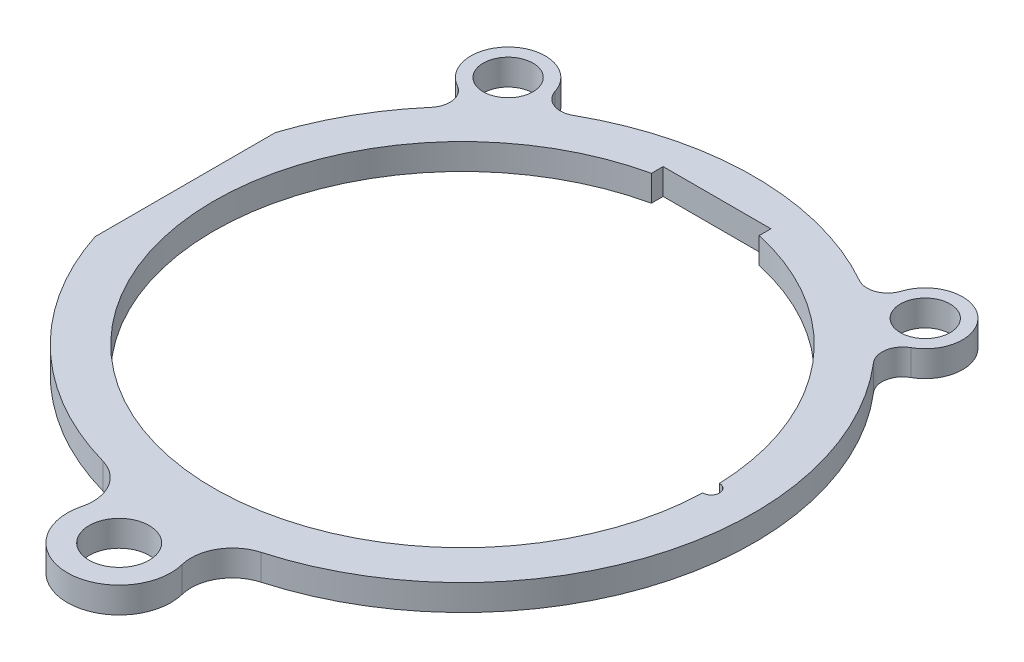
ISO-10303-21;
HEADER;
FILE_DESCRIPTION(('STEP AP214'),'2;1');
FILE_NAME('part.step','',(''),(''),'','','');
FILE_SCHEMA(('AUTOMOTIVE_DESIGN { 1 0 10303 214 1 1 1 1 }'));
ENDSEC;
DATA;
#1=APPLICATION_CONTEXT('core data for automotive mechanical design processes');
#2=APPLICATION_PROTOCOL_DEFINITION('international standard','automotive_design',2000,#1);
#3=PRODUCT_CONTEXT('',#1,'mechanical');
#4=PRODUCT('Part','Part','',(#3));
#5=PRODUCT_RELATED_PRODUCT_CATEGORY('part','',(#4));
#6=PRODUCT_DEFINITION_FORMATION('','',#4);
#7=PRODUCT_DEFINITION_CONTEXT('part definition',#1,'design');
#8=PRODUCT_DEFINITION('design','',#6,#7);
#9=PRODUCT_DEFINITION_SHAPE('','',#8);
#10=(LENGTH_UNIT() NAMED_UNIT(*) SI_UNIT(.MILLI.,.METRE.));
#11=(NAMED_UNIT(*) PLANE_ANGLE_UNIT() SI_UNIT($,.RADIAN.));
#12=(NAMED_UNIT(*) SI_UNIT($,.STERADIAN.) SOLID_ANGLE_UNIT());
#13=UNCERTAINTY_MEASURE_WITH_UNIT(LENGTH_MEASURE(1.E-05),#10,'distance_accuracy_value','');
#14=(GEOMETRIC_REPRESENTATION_CONTEXT(3) GLOBAL_UNCERTAINTY_ASSIGNED_CONTEXT((#13)) GLOBAL_UNIT_ASSIGNED_CONTEXT((#10,
#11,#12)) REPRESENTATION_CONTEXT('',''));
#15=CARTESIAN_POINT('',(0.,0.,0.));
#16=DIRECTION('',(0.,0.,1.));
#17=DIRECTION('',(1.,0.,0.));
#18=AXIS2_PLACEMENT_3D('',#15,#16,#17);
#19=CARTESIAN_POINT('',(0.,-0.79375,0.));
#20=DIRECTION('',(0.,1.,0.));
#21=DIRECTION('',(0.,0.,1.));
#22=AXIS2_PLACEMENT_3D('',#19,#20,#21);
#23=CYLINDRICAL_SURFACE('',#22,17.8599650524873);
#24=CARTESIAN_POINT('',(0.,-0.79375,0.));
#25=DIRECTION('',(0.,1.,0.));
#26=DIRECTION('',(0.,0.,1.));
#27=AXIS2_PLACEMENT_3D('',#24,#25,#26);
#28=CIRCLE('',#27,17.8599650524873);
#29=CARTESIAN_POINT('',(-16.9840587441892,-0.79375,5.5245));
#30=VERTEX_POINT('',#29);
#31=CARTESIAN_POINT('',(-4.85058295667171,-0.79375,17.1886647723584));
#32=VERTEX_POINT('',#31);
#33=EDGE_CURVE('E278',#30,#32,#28,.T.);
#34=ORIENTED_EDGE('',*,*,#33,.T.);
#35=DIRECTION('',(0.,1.,0.));
#36=VECTOR('',#35,1.);
#37=CARTESIAN_POINT('',(-4.85058295667171,-0.79375,17.1886647723584));
#38=LINE('',#37,#36);
#39=CARTESIAN_POINT('',(-4.85058295667171,0.79375,17.1886647723584));
#40=VERTEX_POINT('',#39);
#41=EDGE_CURVE('E216',#32,#40,#38,.T.);
#42=ORIENTED_EDGE('',*,*,#41,.T.);
#43=CARTESIAN_POINT('',(0.,0.79375,0.));
#44=DIRECTION('',(0.,1.,0.));
#45=DIRECTION('',(0.,0.,1.));
#46=AXIS2_PLACEMENT_3D('',#43,#44,#45);
#47=CIRCLE('',#46,17.8599650524873);
#48=CARTESIAN_POINT('',(-16.9840587441892,0.79375,5.5245));
#49=VERTEX_POINT('',#48);
#50=EDGE_CURVE('E271',#49,#40,#47,.T.);
#51=ORIENTED_EDGE('',*,*,#50,.F.);
#52=DIRECTION('',(0.,1.,0.));
#53=VECTOR('',#52,1.);
#54=CARTESIAN_POINT('',(-16.9840587441892,-0.79375,5.5245));
#55=LINE('',#54,#53);
#56=EDGE_CURVE('E302',#30,#49,#55,.T.);
#57=ORIENTED_EDGE('',*,*,#56,.F.);
#58=EDGE_LOOP('',(#34,#42,#51,#57));
#59=FACE_BOUND('',#58,.T.);
#60=ADVANCED_FACE('F35',(#59),#23,.T.);
#61=CARTESIAN_POINT('',(0.,-0.79375,0.));
#62=DIRECTION('',(0.,1.,0.));
#63=DIRECTION('',(0.,0.,1.));
#64=AXIS2_PLACEMENT_3D('',#61,#62,#63);
#65=CYLINDRICAL_SURFACE('',#64,17.8599650524873);
#66=DIRECTION('',(0.,1.,0.));
#67=VECTOR('',#66,1.);
#68=CARTESIAN_POINT('',(4.85058295667171,-0.79375,17.1886647723584));
#69=LINE('',#68,#67);
#70=CARTESIAN_POINT('',(4.85058295667171,-0.79375,17.1886647723584));
#71=VERTEX_POINT('',#70);
#72=CARTESIAN_POINT('',(4.85058295667171,0.79375,17.1886647723584));
#73=VERTEX_POINT('',#72);
#74=EDGE_CURVE('E195',#71,#73,#69,.T.);
#75=ORIENTED_EDGE('',*,*,#74,.F.);
#76=CARTESIAN_POINT('',(0.,-0.79375,0.));
#77=DIRECTION('',(0.,1.,0.));
#78=DIRECTION('',(0.,0.,1.));
#79=AXIS2_PLACEMENT_3D('',#76,#77,#78);
#80=CIRCLE('',#79,17.8599650524873);
#81=CARTESIAN_POINT('',(13.5461924936276,-0.79375,-11.639545549619));
#82=VERTEX_POINT('',#81);
#83=EDGE_CURVE('E182',#71,#82,#80,.T.);
#84=ORIENTED_EDGE('',*,*,#83,.T.);
#85=DIRECTION('',(0.,1.,0.));
#86=VECTOR('',#85,1.);
#87=CARTESIAN_POINT('',(13.5461924936276,-0.79375,-11.639545549619));
#88=LINE('',#87,#86);
#89=CARTESIAN_POINT('',(13.5461924936276,0.79375,-11.639545549619));
#90=VERTEX_POINT('',#89);
#91=EDGE_CURVE('E268',#82,#90,#88,.T.);
#92=ORIENTED_EDGE('',*,*,#91,.T.);
#93=CARTESIAN_POINT('',(0.,0.79375,0.));
#94=DIRECTION('',(0.,1.,0.));
#95=DIRECTION('',(0.,0.,1.));
#96=AXIS2_PLACEMENT_3D('',#93,#94,#95);
#97=CIRCLE('',#96,17.8599650524873);
#98=EDGE_CURVE('E282',#73,#90,#97,.T.);
#99=ORIENTED_EDGE('',*,*,#98,.F.);
#100=EDGE_LOOP('',(#75,#84,#92,#99));
#101=FACE_BOUND('',#100,.T.);
#102=ADVANCED_FACE('F378',(#101),#65,.T.);
#103=CARTESIAN_POINT('',(0.,0.79375,0.));
#104=DIRECTION('',(0.,1.,0.));
#105=DIRECTION('',(0.,0.,1.));
#106=AXIS2_PLACEMENT_3D('',#103,#104,#105);
#107=PLANE('',#106);
#108=CARTESIAN_POINT('',(5.54042085242001,0.79375,19.6331941089771));
#109=DIRECTION('',(0.,1.,0.));
#110=DIRECTION('',(0.,0.,1.));
#111=AXIS2_PLACEMENT_3D('',#108,#109,#110);
#112=CIRCLE('',#111,2.54);
#113=CARTESIAN_POINT('',(3.07801158467778,0.79375,20.2562034172039));
#114=VERTEX_POINT('',#113);
#115=EDGE_CURVE('E191',#73,#114,#112,.T.);
#116=ORIENTED_EDGE('',*,*,#115,.F.);
#117=ORIENTED_EDGE('',*,*,#98,.T.);
#118=CARTESIAN_POINT('',(14.509445468443,0.79375,-12.4672192211281));
#119=DIRECTION('',(0.,1.,0.));
#120=DIRECTION('',(0.,0.,1.));
#121=AXIS2_PLACEMENT_3D('',#118,#119,#120);
#122=CIRCLE('',#121,1.27);
#123=CARTESIAN_POINT('',(13.8915505130217,0.79375,-13.5767713037564));
#124=VERTEX_POINT('',#123);
#125=EDGE_CURVE('E240',#124,#90,#122,.T.);
#126=ORIENTED_EDGE('',*,*,#125,.F.);
#127=CARTESIAN_POINT('',(12.7793395932632,0.79375,-15.5739650524873));
#128=DIRECTION('',(0.,1.,0.));
#129=DIRECTION('',(0.,0.,1.));
#130=AXIS2_PLACEMENT_3D('',#127,#128,#129);
#131=CIRCLE('',#130,2.28599999999999);
#132=CARTESIAN_POINT('',(10.6034384604149,0.79375,-16.2748575264587));
#133=VERTEX_POINT('',#132);
#134=EDGE_CURVE('E260',#124,#133,#131,.T.);
#135=ORIENTED_EDGE('',*,*,#134,.T.);
#136=CARTESIAN_POINT('',(9.39460449772144,0.79375,-16.6642422342205));
#137=DIRECTION('',(0.,1.,0.));
#138=DIRECTION('',(0.,0.,1.));
#139=AXIS2_PLACEMENT_3D('',#136,#137,#138);
#140=CIRCLE('',#139,1.27);
#141=CARTESIAN_POINT('',(8.77091555321106,0.79375,-15.5579366252247));
#142=VERTEX_POINT('',#141);
#143=EDGE_CURVE('E263',#142,#133,#140,.T.);
#144=ORIENTED_EDGE('',*,*,#143,.F.);
#145=CARTESIAN_POINT('',(0.,0.79375,0.));
#146=DIRECTION('',(0.,1.,0.));
#147=DIRECTION('',(0.,0.,1.));
#148=AXIS2_PLACEMENT_3D('',#145,#146,#147);
#149=CIRCLE('',#148,17.8599650524873);
#150=CARTESIAN_POINT('',(-8.77091555321106,0.79375,-15.5579366252247));
#151=VERTEX_POINT('',#150);
#152=EDGE_CURVE('E58',#142,#151,#149,.T.);
#153=ORIENTED_EDGE('',*,*,#152,.T.);
#154=CARTESIAN_POINT('',(-9.39460449772144,0.79375,-16.6642422342205));
#155=DIRECTION('',(0.,1.,0.));
#156=DIRECTION('',(0.,0.,1.));
#157=AXIS2_PLACEMENT_3D('',#154,#155,#156);
#158=CIRCLE('',#157,1.27);
#159=CARTESIAN_POINT('',(-10.6034384604149,0.79375,-16.2748575264587));
#160=VERTEX_POINT('',#159);
#161=EDGE_CURVE('E215',#160,#151,#158,.T.);
#162=ORIENTED_EDGE('',*,*,#161,.F.);
#163=CARTESIAN_POINT('',(-12.7793395932632,0.79375,-15.5739650524873));
#164=DIRECTION('',(0.,1.,0.));
#165=DIRECTION('',(0.,0.,1.));
#166=AXIS2_PLACEMENT_3D('',#163,#164,#165);
#167=CIRCLE('',#166,2.28599999999999);
#168=CARTESIAN_POINT('',(-13.8915505130217,0.79375,-13.5767713037564));
#169=VERTEX_POINT('',#168);
#170=EDGE_CURVE('E233',#160,#169,#167,.T.);
#171=ORIENTED_EDGE('',*,*,#170,.T.);
#172=CARTESIAN_POINT('',(-14.509445468443,0.79375,-12.4672192211281));
#173=DIRECTION('',(0.,1.,0.));
#174=DIRECTION('',(0.,0.,1.));
#175=AXIS2_PLACEMENT_3D('',#172,#173,#174);
#176=CIRCLE('',#175,1.27);
#177=CARTESIAN_POINT('',(-13.5461924936276,0.79375,-11.639545549619));
#178=VERTEX_POINT('',#177);
#179=EDGE_CURVE('E50',#178,#169,#176,.T.);
#180=ORIENTED_EDGE('',*,*,#179,.F.);
#181=CARTESIAN_POINT('',(-16.9840587441892,0.79375,-5.5245));
#182=VERTEX_POINT('',#181);
#183=EDGE_CURVE('E290',#178,#182,#149,.T.);
#184=ORIENTED_EDGE('',*,*,#183,.T.);
#185=DIRECTION('',(0.,0.,-1.));
#186=VECTOR('',#185,1.);
#187=CARTESIAN_POINT('',(-16.9840587441892,0.79375,-5.5245));
#188=LINE('',#187,#186);
#189=EDGE_CURVE('E298',#49,#182,#188,.T.);
#190=ORIENTED_EDGE('',*,*,#189,.F.);
#191=ORIENTED_EDGE('',*,*,#50,.T.);
#192=CARTESIAN_POINT('',(-5.54042085242001,0.79375,19.6331941089771));
#193=DIRECTION('',(0.,1.,0.));
#194=DIRECTION('',(0.,0.,1.));
#195=AXIS2_PLACEMENT_3D('',#192,#193,#194);
#196=CIRCLE('',#195,2.54);
#197=CARTESIAN_POINT('',(-3.07801158467778,0.79375,20.2562034172039));
#198=VERTEX_POINT('',#197);
#199=EDGE_CURVE('E203',#198,#40,#196,.T.);
#200=ORIENTED_EDGE('',*,*,#199,.F.);
#201=CARTESIAN_POINT('',(0.,0.79375,21.0349650524873));
#202=DIRECTION('',(0.,1.,0.));
#203=DIRECTION('',(0.,0.,1.));
#204=AXIS2_PLACEMENT_3D('',#201,#202,#203);
#205=CIRCLE('',#204,3.175);
#206=EDGE_CURVE('E210',#198,#114,#205,.T.);
#207=ORIENTED_EDGE('',*,*,#206,.T.);
#208=EDGE_LOOP('',(#116,#117,#126,#135,#144,#153,#162,#171,#180,#184,#190,#191,#200,#207));
#209=FACE_BOUND('',#208,.T.);
#210=CARTESIAN_POINT('',(15.24,0.79375,0.));
#211=DIRECTION('',(0.,1.,0.));
#212=DIRECTION('',(0.,0.,1.));
#213=AXIS2_PLACEMENT_3D('',#210,#211,#212);
#214=CIRCLE('',#213,0.508000000000006);
#215=CARTESIAN_POINT('',(15.2315333333333,0.79375,0.507929439544078));
#216=VERTEX_POINT('',#215);
#217=CARTESIAN_POINT('',(15.2315333333333,0.79375,-0.507929439544078));
#218=VERTEX_POINT('',#217);
#219=EDGE_CURVE('E287',#216,#218,#214,.T.);
#220=ORIENTED_EDGE('',*,*,#219,.F.);
#221=CARTESIAN_POINT('',(0.,0.79375,0.));
#222=DIRECTION('',(0.,1.,0.));
#223=DIRECTION('',(0.,0.,1.));
#224=AXIS2_PLACEMENT_3D('',#221,#222,#223);
#225=CIRCLE('',#224,15.24);
#226=CARTESIAN_POINT('',(-3.302,0.79375,-14.8779835999372));
#227=VERTEX_POINT('',#226);
#228=EDGE_CURVE('E311',#227,#216,#225,.T.);
#229=ORIENTED_EDGE('',*,*,#228,.F.);
#230=DIRECTION('',(0.,0.,1.));
#231=VECTOR('',#230,1.);
#232=CARTESIAN_POINT('',(-3.30199999999999,0.79375,0.));
#233=LINE('',#232,#231);
#234=CARTESIAN_POINT('',(-3.302,0.79375,-15.5956));
#235=VERTEX_POINT('',#234);
#236=EDGE_CURVE('E314',#235,#227,#233,.T.);
#237=ORIENTED_EDGE('',*,*,#236,.F.);
#238=DIRECTION('',(1.,0.,0.));
#239=VECTOR('',#238,1.);
#240=CARTESIAN_POINT('',(0.,0.79375,-15.5956));
#241=LINE('',#240,#239);
#242=CARTESIAN_POINT('',(3.302,0.79375,-15.5956));
#243=VERTEX_POINT('',#242);
#244=EDGE_CURVE('E318',#235,#243,#241,.T.);
#245=ORIENTED_EDGE('',*,*,#244,.T.);
#246=DIRECTION('',(0.,0.,1.));
#247=VECTOR('',#246,1.);
#248=CARTESIAN_POINT('',(3.302,0.79375,0.));
#249=LINE('',#248,#247);
#250=CARTESIAN_POINT('',(3.302,0.79375,-14.8779835999372));
#251=VERTEX_POINT('',#250);
#252=EDGE_CURVE('E320',#243,#251,#249,.T.);
#253=ORIENTED_EDGE('',*,*,#252,.T.);
#254=EDGE_CURVE('E315',#218,#251,#225,.T.);
#255=ORIENTED_EDGE('',*,*,#254,.F.);
#256=EDGE_LOOP('',(#220,#229,#237,#245,#253,#255));
#257=FACE_BOUND('',#256,.T.);
#258=CARTESIAN_POINT('',(12.7793395932632,0.79375,-15.5739650524873));
#259=DIRECTION('',(0.,1.,0.));
#260=DIRECTION('',(0.,0.,1.));
#261=AXIS2_PLACEMENT_3D('',#258,#259,#260);
#262=CIRCLE('',#261,1.524);
#263=CARTESIAN_POINT('',(12.7793395932632,0.79375,-14.0499650524873));
#264=VERTEX_POINT('',#263);
#265=EDGE_CURVE('E249',#264,#264,#262,.T.);
#266=ORIENTED_EDGE('',*,*,#265,.F.);
#267=EDGE_LOOP('',(#266));
#268=FACE_BOUND('',#267,.T.);
#269=CARTESIAN_POINT('',(-12.7793395932632,0.79375,-15.5739650524873));
#270=DIRECTION('',(0.,1.,0.));
#271=DIRECTION('',(0.,0.,1.));
#272=AXIS2_PLACEMENT_3D('',#269,#270,#271);
#273=CIRCLE('',#272,1.524);
#274=CARTESIAN_POINT('',(-12.7793395932632,0.79375,-14.0499650524873));
#275=VERTEX_POINT('',#274);
#276=EDGE_CURVE('E223',#275,#275,#273,.T.);
#277=ORIENTED_EDGE('',*,*,#276,.F.);
#278=EDGE_LOOP('',(#277));
#279=FACE_BOUND('',#278,.T.);
#280=CARTESIAN_POINT('',(0.,0.79375,21.0349650524873));
#281=DIRECTION('',(0.,1.,0.));
#282=DIRECTION('',(0.,0.,1.));
#283=AXIS2_PLACEMENT_3D('',#280,#281,#282);
#284=CIRCLE('',#283,1.8415);
#285=CARTESIAN_POINT('',(0.,0.79375,22.8764650524873));
#286=VERTEX_POINT('',#285);
#287=EDGE_CURVE('E207',#286,#286,#284,.T.);
#288=ORIENTED_EDGE('',*,*,#287,.F.);
#289=EDGE_LOOP('',(#288));
#290=FACE_BOUND('',#289,.T.);
#291=ADVANCED_FACE('F364',(#209,#257,#268,#279,#290),#107,.T.);
#292=CARTESIAN_POINT('',(0.,-0.79375,0.));
#293=DIRECTION('',(0.,1.,0.));
#294=DIRECTION('',(0.,0.,1.));
#295=AXIS2_PLACEMENT_3D('',#292,#293,#294);
#296=PLANE('',#295);
#297=ORIENTED_EDGE('',*,*,#83,.F.);
#298=CARTESIAN_POINT('',(5.54042085242001,-0.79375,19.6331941089771));
#299=DIRECTION('',(0.,1.,0.));
#300=DIRECTION('',(0.,0.,1.));
#301=AXIS2_PLACEMENT_3D('',#298,#299,#300);
#302=CIRCLE('',#301,2.54);
#303=CARTESIAN_POINT('',(3.07801158467778,-0.79375,20.2562034172039));
#304=VERTEX_POINT('',#303);
#305=EDGE_CURVE('E175',#71,#304,#302,.T.);
#306=ORIENTED_EDGE('',*,*,#305,.T.);
#307=CARTESIAN_POINT('',(0.,-0.79375,21.0349650524873));
#308=DIRECTION('',(0.,1.,0.));
#309=DIRECTION('',(0.,0.,1.));
#310=AXIS2_PLACEMENT_3D('',#307,#308,#309);
#311=CIRCLE('',#310,3.175);
#312=CARTESIAN_POINT('',(-3.07801158467778,-0.79375,20.2562034172039));
#313=VERTEX_POINT('',#312);
#314=EDGE_CURVE('E180',#313,#304,#311,.T.);
#315=ORIENTED_EDGE('',*,*,#314,.F.);
#316=CARTESIAN_POINT('',(-5.54042085242001,-0.79375,19.6331941089771));
#317=DIRECTION('',(0.,1.,0.));
#318=DIRECTION('',(0.,0.,1.));
#319=AXIS2_PLACEMENT_3D('',#316,#317,#318);
#320=CIRCLE('',#319,2.54);
#321=EDGE_CURVE('E186',#313,#32,#320,.T.);
#322=ORIENTED_EDGE('',*,*,#321,.T.);
#323=ORIENTED_EDGE('',*,*,#33,.F.);
#324=DIRECTION('',(0.,0.,-1.));
#325=VECTOR('',#324,1.);
#326=CARTESIAN_POINT('',(-16.9840587441892,-0.79375,-5.5245));
#327=LINE('',#326,#325);
#328=CARTESIAN_POINT('',(-16.9840587441892,-0.79375,-5.5245));
#329=VERTEX_POINT('',#328);
#330=EDGE_CURVE('E299',#30,#329,#327,.T.);
#331=ORIENTED_EDGE('',*,*,#330,.T.);
#332=CARTESIAN_POINT('',(0.,-0.79375,0.));
#333=DIRECTION('',(0.,1.,0.));
#334=DIRECTION('',(0.,0.,1.));
#335=AXIS2_PLACEMENT_3D('',#332,#333,#334);
#336=CIRCLE('',#335,17.8599650524873);
#337=CARTESIAN_POINT('',(-13.5461924936276,-0.79375,-11.639545549619));
#338=VERTEX_POINT('',#337);
#339=EDGE_CURVE('E281',#338,#329,#336,.T.);
#340=ORIENTED_EDGE('',*,*,#339,.F.);
#341=CARTESIAN_POINT('',(-14.509445468443,-0.79375,-12.4672192211281));
#342=DIRECTION('',(0.,1.,0.));
#343=DIRECTION('',(0.,0.,1.));
#344=AXIS2_PLACEMENT_3D('',#341,#342,#343);
#345=CIRCLE('',#344,1.27);
#346=CARTESIAN_POINT('',(-13.8915505130217,-0.79375,-13.5767713037564));
#347=VERTEX_POINT('',#346);
#348=EDGE_CURVE('E226',#338,#347,#345,.T.);
#349=ORIENTED_EDGE('',*,*,#348,.T.);
#350=CARTESIAN_POINT('',(-12.7793395932632,-0.79375,-15.5739650524873));
#351=DIRECTION('',(0.,1.,0.));
#352=DIRECTION('',(0.,0.,1.));
#353=AXIS2_PLACEMENT_3D('',#350,#351,#352);
#354=CIRCLE('',#353,2.28599999999999);
#355=CARTESIAN_POINT('',(-10.6034384604149,-0.79375,-16.2748575264587));
#356=VERTEX_POINT('',#355);
#357=EDGE_CURVE('E222',#356,#347,#354,.T.);
#358=ORIENTED_EDGE('',*,*,#357,.F.);
#359=CARTESIAN_POINT('',(-9.39460449772144,-0.79375,-16.6642422342205));
#360=DIRECTION('',(0.,1.,0.));
#361=DIRECTION('',(0.,0.,1.));
#362=AXIS2_PLACEMENT_3D('',#359,#360,#361);
#363=CIRCLE('',#362,1.27);
#364=CARTESIAN_POINT('',(-8.77091555321106,-0.79375,-15.5579366252247));
#365=VERTEX_POINT('',#364);
#366=EDGE_CURVE('E220',#356,#365,#363,.T.);
#367=ORIENTED_EDGE('',*,*,#366,.T.);
#368=CARTESIAN_POINT('',(8.77091555321106,-0.79375,-15.5579366252247));
#369=VERTEX_POINT('',#368);
#370=EDGE_CURVE('E283',#369,#365,#336,.T.);
#371=ORIENTED_EDGE('',*,*,#370,.F.);
#372=CARTESIAN_POINT('',(9.39460449772144,-0.79375,-16.6642422342205));
#373=DIRECTION('',(0.,1.,0.));
#374=DIRECTION('',(0.,0.,1.));
#375=AXIS2_PLACEMENT_3D('',#372,#373,#374);
#376=CIRCLE('',#375,1.27);
#377=CARTESIAN_POINT('',(10.6034384604149,-0.79375,-16.2748575264587));
#378=VERTEX_POINT('',#377);
#379=EDGE_CURVE('E252',#369,#378,#376,.T.);
#380=ORIENTED_EDGE('',*,*,#379,.T.);
#381=CARTESIAN_POINT('',(12.7793395932632,-0.79375,-15.5739650524873));
#382=DIRECTION('',(0.,1.,0.));
#383=DIRECTION('',(0.,0.,1.));
#384=AXIS2_PLACEMENT_3D('',#381,#382,#383);
#385=CIRCLE('',#384,2.28599999999999);
#386=CARTESIAN_POINT('',(13.8915505130217,-0.79375,-13.5767713037564));
#387=VERTEX_POINT('',#386);
#388=EDGE_CURVE('E248',#387,#378,#385,.T.);
#389=ORIENTED_EDGE('',*,*,#388,.F.);
#390=CARTESIAN_POINT('',(14.509445468443,-0.79375,-12.4672192211281));
#391=DIRECTION('',(0.,1.,0.));
#392=DIRECTION('',(0.,0.,1.));
#393=AXIS2_PLACEMENT_3D('',#390,#391,#392);
#394=CIRCLE('',#393,1.27);
#395=EDGE_CURVE('E246',#387,#82,#394,.T.);
#396=ORIENTED_EDGE('',*,*,#395,.T.);
#397=EDGE_LOOP('',(#297,#306,#315,#322,#323,#331,#340,#349,#358,#367,#371,#380,#389,#396));
#398=FACE_BOUND('',#397,.T.);
#399=CARTESIAN_POINT('',(0.,-0.79375,0.));
#400=DIRECTION('',(0.,1.,0.));
#401=DIRECTION('',(0.,0.,1.));
#402=AXIS2_PLACEMENT_3D('',#399,#400,#401);
#403=CIRCLE('',#402,15.24);
#404=CARTESIAN_POINT('',(-3.302,-0.79375,-14.8779835999372));
#405=VERTEX_POINT('',#404);
#406=CARTESIAN_POINT('',(15.2315333333333,-0.79375,0.507929439544078));
#407=VERTEX_POINT('',#406);
#408=EDGE_CURVE('E324',#405,#407,#403,.T.);
#409=ORIENTED_EDGE('',*,*,#408,.T.);
#410=CARTESIAN_POINT('',(15.24,-0.79375,0.));
#411=DIRECTION('',(0.,1.,0.));
#412=DIRECTION('',(0.,0.,1.));
#413=AXIS2_PLACEMENT_3D('',#410,#411,#412);
#414=CIRCLE('',#413,0.508000000000006);
#415=CARTESIAN_POINT('',(15.2315333333333,-0.79375,-0.50792943954407));
#416=VERTEX_POINT('',#415);
#417=EDGE_CURVE('E11',#407,#416,#414,.T.);
#418=ORIENTED_EDGE('',*,*,#417,.T.);
#419=CARTESIAN_POINT('',(3.302,-0.79375,-14.8779835999372));
#420=VERTEX_POINT('',#419);
#421=EDGE_CURVE('E308',#416,#420,#403,.T.);
#422=ORIENTED_EDGE('',*,*,#421,.T.);
#423=DIRECTION('',(0.,0.,1.));
#424=VECTOR('',#423,1.);
#425=CARTESIAN_POINT('',(3.302,-0.79375,0.));
#426=LINE('',#425,#424);
#427=CARTESIAN_POINT('',(3.302,-0.79375,-15.5956));
#428=VERTEX_POINT('',#427);
#429=EDGE_CURVE('E332',#428,#420,#426,.T.);
#430=ORIENTED_EDGE('',*,*,#429,.F.);
#431=DIRECTION('',(1.,0.,0.));
#432=VECTOR('',#431,1.);
#433=CARTESIAN_POINT('',(0.,-0.79375,-15.5956));
#434=LINE('',#433,#432);
#435=CARTESIAN_POINT('',(-3.302,-0.79375,-15.5956));
#436=VERTEX_POINT('',#435);
#437=EDGE_CURVE('E330',#436,#428,#434,.T.);
#438=ORIENTED_EDGE('',*,*,#437,.F.);
#439=DIRECTION('',(0.,0.,1.));
#440=VECTOR('',#439,1.);
#441=CARTESIAN_POINT('',(-3.30199999999999,-0.79375,0.));
#442=LINE('',#441,#440);
#443=EDGE_CURVE('E327',#436,#405,#442,.T.);
#444=ORIENTED_EDGE('',*,*,#443,.T.);
#445=EDGE_LOOP('',(#409,#418,#422,#430,#438,#444));
#446=FACE_BOUND('',#445,.T.);
#447=CARTESIAN_POINT('',(12.7793395932632,-0.79375,-15.5739650524873));
#448=DIRECTION('',(0.,1.,0.));
#449=DIRECTION('',(0.,0.,1.));
#450=AXIS2_PLACEMENT_3D('',#447,#448,#449);
#451=CIRCLE('',#450,1.524);
#452=CARTESIAN_POINT('',(12.7793395932632,-0.79375,-14.0499650524873));
#453=VERTEX_POINT('',#452);
#454=EDGE_CURVE('E254',#453,#453,#451,.T.);
#455=ORIENTED_EDGE('',*,*,#454,.T.);
#456=EDGE_LOOP('',(#455));
#457=FACE_BOUND('',#456,.T.);
#458=CARTESIAN_POINT('',(-12.7793395932632,-0.79375,-15.5739650524873));
#459=DIRECTION('',(0.,1.,0.));
#460=DIRECTION('',(0.,0.,1.));
#461=AXIS2_PLACEMENT_3D('',#458,#459,#460);
#462=CIRCLE('',#461,1.524);
#463=CARTESIAN_POINT('',(-12.7793395932632,-0.79375,-14.0499650524873));
#464=VERTEX_POINT('',#463);
#465=EDGE_CURVE('E228',#464,#464,#462,.T.);
#466=ORIENTED_EDGE('',*,*,#465,.T.);
#467=EDGE_LOOP('',(#466));
#468=FACE_BOUND('',#467,.T.);
#469=CARTESIAN_POINT('',(0.,-0.79375,21.0349650524873));
#470=DIRECTION('',(0.,1.,0.));
#471=DIRECTION('',(0.,0.,1.));
#472=AXIS2_PLACEMENT_3D('',#469,#470,#471);
#473=CIRCLE('',#472,1.8415);
#474=CARTESIAN_POINT('',(0.,-0.79375,22.8764650524873));
#475=VERTEX_POINT('',#474);
#476=EDGE_CURVE('E200',#475,#475,#473,.T.);
#477=ORIENTED_EDGE('',*,*,#476,.T.);
#478=EDGE_LOOP('',(#477));
#479=FACE_BOUND('',#478,.T.);
#480=ADVANCED_FACE('F177',(#398,#446,#457,#468,#479),#296,.F.);
#481=CARTESIAN_POINT('',(0.,0.79375,0.));
#482=DIRECTION('',(0.,-1.,0.));
#483=DIRECTION('',(0.,0.,-1.));
#484=AXIS2_PLACEMENT_3D('',#481,#482,#483);
#485=CYLINDRICAL_SURFACE('',#484,15.24);
#486=DIRECTION('',(0.,1.,0.));
#487=VECTOR('',#486,1.);
#488=CARTESIAN_POINT('',(15.2315333333333,0.,0.507929439544078));
#489=LINE('',#488,#487);
#490=EDGE_CURVE('E296',#407,#216,#489,.T.);
#491=ORIENTED_EDGE('',*,*,#490,.F.);
#492=ORIENTED_EDGE('',*,*,#408,.F.);
#493=DIRECTION('',(0.,-1.,0.));
#494=VECTOR('',#493,1.);
#495=CARTESIAN_POINT('',(-3.302,0.79375,-14.8779835999372));
#496=LINE('',#495,#494);
#497=EDGE_CURVE('E43',#227,#405,#496,.T.);
#498=ORIENTED_EDGE('',*,*,#497,.F.);
#499=ORIENTED_EDGE('',*,*,#228,.T.);
#500=EDGE_LOOP('',(#491,#492,#498,#499));
#501=FACE_BOUND('',#500,.T.);
#502=ADVANCED_FACE('F349',(#501),#485,.F.);
#503=DIRECTION('',(0.,1.,0.));
#504=VECTOR('',#503,1.);
#505=CARTESIAN_POINT('',(15.2315333333333,0.,-0.507929439544078));
#506=LINE('',#505,#504);
#507=EDGE_CURVE('E294',#218,#416,#506,.F.);
#508=ORIENTED_EDGE('',*,*,#507,.F.);
#509=ORIENTED_EDGE('',*,*,#254,.T.);
#510=DIRECTION('',(0.,-1.,0.));
#511=VECTOR('',#510,1.);
#512=CARTESIAN_POINT('',(3.302,0.79375,-14.8779835999372));
#513=LINE('',#512,#511);
#514=EDGE_CURVE('E323',#251,#420,#513,.T.);
#515=ORIENTED_EDGE('',*,*,#514,.T.);
#516=ORIENTED_EDGE('',*,*,#421,.F.);
#517=EDGE_LOOP('',(#508,#509,#515,#516));
#518=FACE_BOUND('',#517,.T.);
#519=ADVANCED_FACE('F37',(#518),#485,.F.);
#520=CARTESIAN_POINT('',(-3.30199999999999,0.79375,0.));
#521=DIRECTION('',(1.,0.,0.));
#522=DIRECTION('',(0.,0.,-1.));
#523=AXIS2_PLACEMENT_3D('',#520,#521,#522);
#524=PLANE('',#523);
#525=ORIENTED_EDGE('',*,*,#443,.F.);
#526=DIRECTION('',(0.,-1.,0.));
#527=VECTOR('',#526,1.);
#528=CARTESIAN_POINT('',(-3.302,0.79375,-15.5956));
#529=LINE('',#528,#527);
#530=EDGE_CURVE('E340',#235,#436,#529,.T.);
#531=ORIENTED_EDGE('',*,*,#530,.F.);
#532=ORIENTED_EDGE('',*,*,#236,.T.);
#533=ORIENTED_EDGE('',*,*,#497,.T.);
#534=EDGE_LOOP('',(#525,#531,#532,#533));
#535=FACE_BOUND('',#534,.T.);
#536=ADVANCED_FACE('F344',(#535),#524,.T.);
#537=CARTESIAN_POINT('',(0.,0.79375,-15.5956));
#538=DIRECTION('',(0.,0.,-1.));
#539=DIRECTION('',(-1.,0.,0.));
#540=AXIS2_PLACEMENT_3D('',#537,#538,#539);
#541=PLANE('',#540);
#542=ORIENTED_EDGE('',*,*,#437,.T.);
#543=DIRECTION('',(0.,-1.,0.));
#544=VECTOR('',#543,1.);
#545=CARTESIAN_POINT('',(3.302,0.79375,-15.5956));
#546=LINE('',#545,#544);
#547=EDGE_CURVE('E337',#243,#428,#546,.T.);
#548=ORIENTED_EDGE('',*,*,#547,.F.);
#549=ORIENTED_EDGE('',*,*,#244,.F.);
#550=ORIENTED_EDGE('',*,*,#530,.T.);
#551=EDGE_LOOP('',(#542,#548,#549,#550));
#552=FACE_BOUND('',#551,.T.);
#553=ADVANCED_FACE('F355',(#552),#541,.F.);
#554=CARTESIAN_POINT('',(3.302,0.79375,0.));
#555=DIRECTION('',(1.,0.,0.));
#556=DIRECTION('',(0.,0.,-1.));
#557=AXIS2_PLACEMENT_3D('',#554,#555,#556);
#558=PLANE('',#557);
#559=ORIENTED_EDGE('',*,*,#429,.T.);
#560=ORIENTED_EDGE('',*,*,#514,.F.);
#561=ORIENTED_EDGE('',*,*,#252,.F.);
#562=ORIENTED_EDGE('',*,*,#547,.T.);
#563=EDGE_LOOP('',(#559,#560,#561,#562));
#564=FACE_BOUND('',#563,.T.);
#565=ADVANCED_FACE('F359',(#564),#558,.F.);
#566=CARTESIAN_POINT('',(-16.9840587441892,-0.79375,-5.5245));
#567=DIRECTION('',(1.,0.,0.));
#568=DIRECTION('',(0.,0.,-1.));
#569=AXIS2_PLACEMENT_3D('',#566,#567,#568);
#570=PLANE('',#569);
#571=ORIENTED_EDGE('',*,*,#189,.T.);
#572=DIRECTION('',(0.,1.,0.));
#573=VECTOR('',#572,1.);
#574=CARTESIAN_POINT('',(-16.9840587441892,-0.79375,-5.5245));
#575=LINE('',#574,#573);
#576=EDGE_CURVE('E305',#329,#182,#575,.T.);
#577=ORIENTED_EDGE('',*,*,#576,.F.);
#578=ORIENTED_EDGE('',*,*,#330,.F.);
#579=ORIENTED_EDGE('',*,*,#56,.T.);
#580=EDGE_LOOP('',(#571,#577,#578,#579));
#581=FACE_BOUND('',#580,.T.);
#582=ADVANCED_FACE('F393',(#581),#570,.F.);
#583=CARTESIAN_POINT('',(15.24,-0.79375,0.));
#584=DIRECTION('',(0.,1.,0.));
#585=DIRECTION('',(0.,0.,1.));
#586=AXIS2_PLACEMENT_3D('',#583,#584,#585);
#587=CYLINDRICAL_SURFACE('',#586,0.508000000000006);
#588=ORIENTED_EDGE('',*,*,#490,.T.);
#589=ORIENTED_EDGE('',*,*,#219,.T.);
#590=ORIENTED_EDGE('',*,*,#507,.T.);
#591=ORIENTED_EDGE('',*,*,#417,.F.);
#592=EDGE_LOOP('',(#588,#589,#590,#591));
#593=FACE_BOUND('',#592,.T.);
#594=ADVANCED_FACE('F368',(#593),#587,.F.);
#595=DIRECTION('',(0.,1.,0.));
#596=VECTOR('',#595,1.);
#597=CARTESIAN_POINT('',(-13.5461924936276,-0.79375,-11.639545549619));
#598=LINE('',#597,#596);
#599=EDGE_CURVE('E241',#338,#178,#598,.T.);
#600=ORIENTED_EDGE('',*,*,#599,.F.);
#601=ORIENTED_EDGE('',*,*,#339,.T.);
#602=ORIENTED_EDGE('',*,*,#576,.T.);
#603=ORIENTED_EDGE('',*,*,#183,.F.);
#604=EDGE_LOOP('',(#600,#601,#602,#603));
#605=FACE_BOUND('',#604,.T.);
#606=ADVANCED_FACE('F387',(#605),#65,.T.);
#607=DIRECTION('',(0.,1.,0.));
#608=VECTOR('',#607,1.);
#609=CARTESIAN_POINT('',(8.77091555321106,-0.79375,-15.5579366252247));
#610=LINE('',#609,#608);
#611=EDGE_CURVE('E272',#369,#142,#610,.T.);
#612=ORIENTED_EDGE('',*,*,#611,.F.);
#613=ORIENTED_EDGE('',*,*,#370,.T.);
#614=DIRECTION('',(0.,1.,0.));
#615=VECTOR('',#614,1.);
#616=CARTESIAN_POINT('',(-8.77091555321106,-0.79375,-15.5579366252247));
#617=LINE('',#616,#615);
#618=EDGE_CURVE('E238',#365,#151,#617,.T.);
#619=ORIENTED_EDGE('',*,*,#618,.T.);
#620=ORIENTED_EDGE('',*,*,#152,.F.);
#621=EDGE_LOOP('',(#612,#613,#619,#620));
#622=FACE_BOUND('',#621,.T.);
#623=ADVANCED_FACE('F388',(#622),#65,.T.);
#624=CARTESIAN_POINT('',(14.509445468443,-0.79375,-12.4672192211281));
#625=DIRECTION('',(0.,1.,0.));
#626=DIRECTION('',(0.,0.,1.));
#627=AXIS2_PLACEMENT_3D('',#624,#625,#626);
#628=CYLINDRICAL_SURFACE('',#627,1.27);
#629=ORIENTED_EDGE('',*,*,#125,.T.);
#630=ORIENTED_EDGE('',*,*,#91,.F.);
#631=ORIENTED_EDGE('',*,*,#395,.F.);
#632=DIRECTION('',(0.,1.,0.));
#633=VECTOR('',#632,1.);
#634=CARTESIAN_POINT('',(13.8915505130217,-0.79375,-13.5767713037564));
#635=LINE('',#634,#633);
#636=EDGE_CURVE('E257',#387,#124,#635,.T.);
#637=ORIENTED_EDGE('',*,*,#636,.T.);
#638=EDGE_LOOP('',(#629,#630,#631,#637));
#639=FACE_BOUND('',#638,.T.);
#640=ADVANCED_FACE('F458',(#639),#628,.F.);
#641=CARTESIAN_POINT('',(9.39460449772144,-0.79375,-16.6642422342205));
#642=DIRECTION('',(0.,1.,0.));
#643=DIRECTION('',(0.,0.,1.));
#644=AXIS2_PLACEMENT_3D('',#641,#642,#643);
#645=CYLINDRICAL_SURFACE('',#644,1.27);
#646=ORIENTED_EDGE('',*,*,#143,.T.);
#647=DIRECTION('',(0.,1.,0.));
#648=VECTOR('',#647,1.);
#649=CARTESIAN_POINT('',(10.6034384604149,-0.79375,-16.2748575264587));
#650=LINE('',#649,#648);
#651=EDGE_CURVE('E275',#378,#133,#650,.T.);
#652=ORIENTED_EDGE('',*,*,#651,.F.);
#653=ORIENTED_EDGE('',*,*,#379,.F.);
#654=ORIENTED_EDGE('',*,*,#611,.T.);
#655=EDGE_LOOP('',(#646,#652,#653,#654));
#656=FACE_BOUND('',#655,.T.);
#657=ADVANCED_FACE('F464',(#656),#645,.F.);
#658=CARTESIAN_POINT('',(12.7793395932632,-0.79375,-15.5739650524873));
#659=DIRECTION('',(0.,1.,0.));
#660=DIRECTION('',(0.,0.,1.));
#661=AXIS2_PLACEMENT_3D('',#658,#659,#660);
#662=CYLINDRICAL_SURFACE('',#661,2.28599999999999);
#663=ORIENTED_EDGE('',*,*,#134,.F.);
#664=ORIENTED_EDGE('',*,*,#636,.F.);
#665=ORIENTED_EDGE('',*,*,#388,.T.);
#666=ORIENTED_EDGE('',*,*,#651,.T.);
#667=EDGE_LOOP('',(#663,#664,#665,#666));
#668=FACE_BOUND('',#667,.T.);
#669=ADVANCED_FACE('F471',(#668),#662,.T.);
#670=CARTESIAN_POINT('',(12.7793395932632,-0.79375,-15.5739650524873));
#671=DIRECTION('',(0.,1.,0.));
#672=DIRECTION('',(0.,0.,1.));
#673=AXIS2_PLACEMENT_3D('',#670,#671,#672);
#674=CYLINDRICAL_SURFACE('',#673,1.524);
#675=ORIENTED_EDGE('',*,*,#454,.F.);
#676=EDGE_LOOP('',(#675));
#677=FACE_BOUND('',#676,.T.);
#678=ORIENTED_EDGE('',*,*,#265,.T.);
#679=EDGE_LOOP('',(#678));
#680=FACE_BOUND('',#679,.T.);
#681=ADVANCED_FACE('F479',(#677,#680),#674,.F.);
#682=CARTESIAN_POINT('',(-9.39460449772144,-0.79375,-16.6642422342205));
#683=DIRECTION('',(0.,1.,0.));
#684=DIRECTION('',(0.,0.,1.));
#685=AXIS2_PLACEMENT_3D('',#682,#683,#684);
#686=CYLINDRICAL_SURFACE('',#685,1.27);
#687=ORIENTED_EDGE('',*,*,#161,.T.);
#688=ORIENTED_EDGE('',*,*,#618,.F.);
#689=ORIENTED_EDGE('',*,*,#366,.F.);
#690=DIRECTION('',(0.,1.,0.));
#691=VECTOR('',#690,1.);
#692=CARTESIAN_POINT('',(-10.6034384604149,-0.79375,-16.2748575264587));
#693=LINE('',#692,#691);
#694=EDGE_CURVE('E231',#356,#160,#693,.T.);
#695=ORIENTED_EDGE('',*,*,#694,.T.);
#696=EDGE_LOOP('',(#687,#688,#689,#695));
#697=FACE_BOUND('',#696,.T.);
#698=ADVANCED_FACE('F487',(#697),#686,.F.);
#699=CARTESIAN_POINT('',(-14.509445468443,-0.79375,-12.4672192211281));
#700=DIRECTION('',(0.,1.,0.));
#701=DIRECTION('',(0.,0.,1.));
#702=AXIS2_PLACEMENT_3D('',#699,#700,#701);
#703=CYLINDRICAL_SURFACE('',#702,1.27);
#704=ORIENTED_EDGE('',*,*,#179,.T.);
#705=DIRECTION('',(0.,1.,0.));
#706=VECTOR('',#705,1.);
#707=CARTESIAN_POINT('',(-13.8915505130217,-0.79375,-13.5767713037564));
#708=LINE('',#707,#706);
#709=EDGE_CURVE('E243',#347,#169,#708,.T.);
#710=ORIENTED_EDGE('',*,*,#709,.F.);
#711=ORIENTED_EDGE('',*,*,#348,.F.);
#712=ORIENTED_EDGE('',*,*,#599,.T.);
#713=EDGE_LOOP('',(#704,#710,#711,#712));
#714=FACE_BOUND('',#713,.T.);
#715=ADVANCED_FACE('F495',(#714),#703,.F.);
#716=CARTESIAN_POINT('',(-12.7793395932632,-0.79375,-15.5739650524873));
#717=DIRECTION('',(0.,1.,0.));
#718=DIRECTION('',(0.,0.,1.));
#719=AXIS2_PLACEMENT_3D('',#716,#717,#718);
#720=CYLINDRICAL_SURFACE('',#719,2.28599999999999);
#721=ORIENTED_EDGE('',*,*,#170,.F.);
#722=ORIENTED_EDGE('',*,*,#694,.F.);
#723=ORIENTED_EDGE('',*,*,#357,.T.);
#724=ORIENTED_EDGE('',*,*,#709,.T.);
#725=EDGE_LOOP('',(#721,#722,#723,#724));
#726=FACE_BOUND('',#725,.T.);
#727=ADVANCED_FACE('F503',(#726),#720,.T.);
#728=CARTESIAN_POINT('',(-12.7793395932632,-0.79375,-15.5739650524873));
#729=DIRECTION('',(0.,1.,0.));
#730=DIRECTION('',(0.,0.,1.));
#731=AXIS2_PLACEMENT_3D('',#728,#729,#730);
#732=CYLINDRICAL_SURFACE('',#731,1.524);
#733=ORIENTED_EDGE('',*,*,#465,.F.);
#734=EDGE_LOOP('',(#733));
#735=FACE_BOUND('',#734,.T.);
#736=ORIENTED_EDGE('',*,*,#276,.T.);
#737=EDGE_LOOP('',(#736));
#738=FACE_BOUND('',#737,.T.);
#739=ADVANCED_FACE('F511',(#735,#738),#732,.F.);
#740=CARTESIAN_POINT('',(0.,-0.79375,21.0349650524873));
#741=DIRECTION('',(0.,1.,0.));
#742=DIRECTION('',(0.,0.,1.));
#743=AXIS2_PLACEMENT_3D('',#740,#741,#742);
#744=CYLINDRICAL_SURFACE('',#743,3.175);
#745=ORIENTED_EDGE('',*,*,#206,.F.);
#746=DIRECTION('',(0.,1.,0.));
#747=VECTOR('',#746,1.);
#748=CARTESIAN_POINT('',(-3.07801158467778,-0.79375,20.2562034172039));
#749=LINE('',#748,#747);
#750=EDGE_CURVE('E198',#313,#198,#749,.T.);
#751=ORIENTED_EDGE('',*,*,#750,.F.);
#752=ORIENTED_EDGE('',*,*,#314,.T.);
#753=DIRECTION('',(0.,1.,0.));
#754=VECTOR('',#753,1.);
#755=CARTESIAN_POINT('',(3.07801158467778,-0.79375,20.2562034172039));
#756=LINE('',#755,#754);
#757=EDGE_CURVE('E189',#304,#114,#756,.T.);
#758=ORIENTED_EDGE('',*,*,#757,.T.);
#759=EDGE_LOOP('',(#745,#751,#752,#758));
#760=FACE_BOUND('',#759,.T.);
#761=ADVANCED_FACE('F197',(#760),#744,.T.);
#762=CARTESIAN_POINT('',(-5.54042085242001,-0.79375,19.6331941089771));
#763=DIRECTION('',(0.,1.,0.));
#764=DIRECTION('',(0.,0.,1.));
#765=AXIS2_PLACEMENT_3D('',#762,#763,#764);
#766=CYLINDRICAL_SURFACE('',#765,2.54);
#767=ORIENTED_EDGE('',*,*,#199,.T.);
#768=ORIENTED_EDGE('',*,*,#41,.F.);
#769=ORIENTED_EDGE('',*,*,#321,.F.);
#770=ORIENTED_EDGE('',*,*,#750,.T.);
#771=EDGE_LOOP('',(#767,#768,#769,#770));
#772=FACE_BOUND('',#771,.T.);
#773=ADVANCED_FACE('F526',(#772),#766,.F.);
#774=CARTESIAN_POINT('',(0.,-0.79375,21.0349650524873));
#775=DIRECTION('',(0.,1.,0.));
#776=DIRECTION('',(0.,0.,1.));
#777=AXIS2_PLACEMENT_3D('',#774,#775,#776);
#778=CYLINDRICAL_SURFACE('',#777,1.8415);
#779=ORIENTED_EDGE('',*,*,#476,.F.);
#780=EDGE_LOOP('',(#779));
#781=FACE_BOUND('',#780,.T.);
#782=ORIENTED_EDGE('',*,*,#287,.T.);
#783=EDGE_LOOP('',(#782));
#784=FACE_BOUND('',#783,.T.);
#785=ADVANCED_FACE('F533',(#781,#784),#778,.F.);
#786=CARTESIAN_POINT('',(5.54042085242001,-0.79375,19.6331941089771));
#787=DIRECTION('',(0.,1.,0.));
#788=DIRECTION('',(0.,0.,1.));
#789=AXIS2_PLACEMENT_3D('',#786,#787,#788);
#790=CYLINDRICAL_SURFACE('',#789,2.54);
#791=ORIENTED_EDGE('',*,*,#115,.T.);
#792=ORIENTED_EDGE('',*,*,#757,.F.);
#793=ORIENTED_EDGE('',*,*,#305,.F.);
#794=ORIENTED_EDGE('',*,*,#74,.T.);
#795=EDGE_LOOP('',(#791,#792,#793,#794));
#796=FACE_BOUND('',#795,.T.);
#797=ADVANCED_FACE('F190',(#796),#790,.F.);
#798=CLOSED_SHELL('',(#60,#102,#291,#480,#502,#519,#536,#553,#565,#582,#594,#606,#623,#640,#657,
#669,#681,#698,#715,#727,#739,#761,#773,#785,#797));
#799=MANIFOLD_SOLID_BREP('B2',#798);
#800=ADVANCED_BREP_SHAPE_REPRESENTATION('',(#18,#799),#14);
#801=SHAPE_DEFINITION_REPRESENTATION(#9,#800);
ENDSEC;
END-ISO-10303-21;
